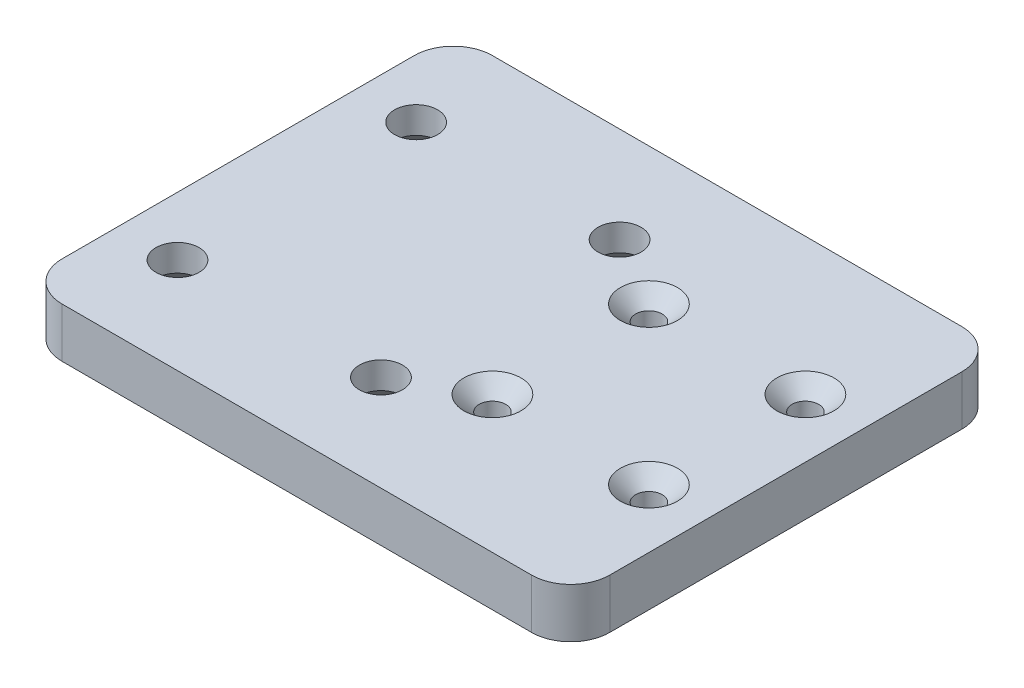
ISO-10303-21;
HEADER;
FILE_DESCRIPTION(('STEP AP214'),'2;1');
FILE_NAME('part.step','',(''),(''),'','','');
FILE_SCHEMA(('AUTOMOTIVE_DESIGN { 1 0 10303 214 1 1 1 1 }'));
ENDSEC;
DATA;
#1=APPLICATION_CONTEXT('core data for automotive mechanical design processes');
#2=APPLICATION_PROTOCOL_DEFINITION('international standard','automotive_design',2000,#1);
#3=PRODUCT_CONTEXT('',#1,'mechanical');
#4=PRODUCT('Part','Part','',(#3));
#5=PRODUCT_RELATED_PRODUCT_CATEGORY('part','',(#4));
#6=PRODUCT_DEFINITION_FORMATION('','',#4);
#7=PRODUCT_DEFINITION_CONTEXT('part definition',#1,'design');
#8=PRODUCT_DEFINITION('design','',#6,#7);
#9=PRODUCT_DEFINITION_SHAPE('','',#8);
#10=(LENGTH_UNIT() NAMED_UNIT(*) SI_UNIT(.MILLI.,.METRE.));
#11=(NAMED_UNIT(*) PLANE_ANGLE_UNIT() SI_UNIT($,.RADIAN.));
#12=(NAMED_UNIT(*) SI_UNIT($,.STERADIAN.) SOLID_ANGLE_UNIT());
#13=UNCERTAINTY_MEASURE_WITH_UNIT(LENGTH_MEASURE(1.E-05),#10,'distance_accuracy_value','');
#14=(GEOMETRIC_REPRESENTATION_CONTEXT(3) GLOBAL_UNCERTAINTY_ASSIGNED_CONTEXT((#13)) GLOBAL_UNIT_ASSIGNED_CONTEXT((#10,
#11,#12)) REPRESENTATION_CONTEXT('',''));
#15=CARTESIAN_POINT('',(0.,0.,0.));
#16=DIRECTION('',(0.,0.,1.));
#17=DIRECTION('',(1.,0.,0.));
#18=AXIS2_PLACEMENT_3D('',#15,#16,#17);
#19=CARTESIAN_POINT('',(0.,6.35,0.));
#20=DIRECTION('',(0.,-1.,0.));
#21=DIRECTION('',(0.,0.,-1.));
#22=AXIS2_PLACEMENT_3D('',#19,#20,#21);
#23=PLANE('',#22);
#24=CARTESIAN_POINT('',(-24.7884036428891,6.34999999999999,15.2500000000005));
#25=DIRECTION('',(0.,-1.,0.));
#26=DIRECTION('',(0.,0.,-1.));
#27=AXIS2_PLACEMENT_3D('',#24,#25,#26);
#28=CIRCLE('',#27,2.74999999999999);
#29=CARTESIAN_POINT('',(-24.7884036428891,6.34999999999999,12.5000000000005));
#30=VERTEX_POINT('',#29);
#31=EDGE_CURVE('E240',#30,#30,#28,.T.);
#32=ORIENTED_EDGE('',*,*,#31,.T.);
#33=EDGE_LOOP('',(#32));
#34=FACE_BOUND('',#33,.T.);
#35=CARTESIAN_POINT('',(-24.7884036428891,6.34999999999999,-15.2499999999995));
#36=DIRECTION('',(0.,-1.,0.));
#37=DIRECTION('',(0.,0.,-1.));
#38=AXIS2_PLACEMENT_3D('',#35,#36,#37);
#39=CIRCLE('',#38,2.74999999999999);
#40=CARTESIAN_POINT('',(-24.7884036428891,6.34999999999999,-17.9999999999995));
#41=VERTEX_POINT('',#40);
#42=EDGE_CURVE('E231',#41,#41,#39,.T.);
#43=ORIENTED_EDGE('',*,*,#42,.T.);
#44=EDGE_LOOP('',(#43));
#45=FACE_BOUND('',#44,.T.);
#46=CARTESIAN_POINT('',(1.21159635711091,6.34999999999999,-15.2500000000005));
#47=DIRECTION('',(0.,-1.,0.));
#48=DIRECTION('',(0.,0.,-1.));
#49=AXIS2_PLACEMENT_3D('',#46,#47,#48);
#50=CIRCLE('',#49,2.74999999999999);
#51=CARTESIAN_POINT('',(1.21159635711091,6.34999999999999,-18.0000000000005));
#52=VERTEX_POINT('',#51);
#53=EDGE_CURVE('E222',#52,#52,#50,.T.);
#54=ORIENTED_EDGE('',*,*,#53,.T.);
#55=EDGE_LOOP('',(#54));
#56=FACE_BOUND('',#55,.T.);
#57=CARTESIAN_POINT('',(1.21159635711091,6.34999999999999,15.2500000000005));
#58=DIRECTION('',(0.,-1.,0.));
#59=DIRECTION('',(0.,0.,-1.));
#60=AXIS2_PLACEMENT_3D('',#57,#58,#59);
#61=CIRCLE('',#60,2.74999999999999);
#62=CARTESIAN_POINT('',(1.21159635711091,6.34999999999999,12.5000000000005));
#63=VERTEX_POINT('',#62);
#64=EDGE_CURVE('E213',#63,#63,#61,.T.);
#65=ORIENTED_EDGE('',*,*,#64,.T.);
#66=EDGE_LOOP('',(#65));
#67=FACE_BOUND('',#66,.T.);
#68=CARTESIAN_POINT('',(30.2115963571109,6.35,10.));
#69=DIRECTION('',(0.,1.,0.));
#70=DIRECTION('',(0.,0.,1.));
#71=AXIS2_PLACEMENT_3D('',#68,#69,#70);
#72=CIRCLE('',#71,3.65);
#73=CARTESIAN_POINT('',(30.2115963571109,6.35,13.65));
#74=VERTEX_POINT('',#73);
#75=EDGE_CURVE('E210',#74,#74,#72,.T.);
#76=ORIENTED_EDGE('',*,*,#75,.F.);
#77=EDGE_LOOP('',(#76));
#78=FACE_BOUND('',#77,.T.);
#79=CARTESIAN_POINT('',(10.2115963571109,6.35,10.));
#80=DIRECTION('',(0.,1.,0.));
#81=DIRECTION('',(0.,0.,1.));
#82=AXIS2_PLACEMENT_3D('',#79,#80,#81);
#83=CIRCLE('',#82,3.65);
#84=CARTESIAN_POINT('',(10.2115963571109,6.35,13.65));
#85=VERTEX_POINT('',#84);
#86=EDGE_CURVE('E201',#85,#85,#83,.T.);
#87=ORIENTED_EDGE('',*,*,#86,.F.);
#88=EDGE_LOOP('',(#87));
#89=FACE_BOUND('',#88,.T.);
#90=CARTESIAN_POINT('',(10.2115963571109,6.35,-9.99999999999999));
#91=DIRECTION('',(0.,1.,0.));
#92=DIRECTION('',(0.,0.,1.));
#93=AXIS2_PLACEMENT_3D('',#90,#91,#92);
#94=CIRCLE('',#93,3.65);
#95=CARTESIAN_POINT('',(10.2115963571109,6.35,-6.34999999999999));
#96=VERTEX_POINT('',#95);
#97=EDGE_CURVE('E192',#96,#96,#94,.T.);
#98=ORIENTED_EDGE('',*,*,#97,.F.);
#99=EDGE_LOOP('',(#98));
#100=FACE_BOUND('',#99,.T.);
#101=DIRECTION('',(-1.,0.,0.));
#102=VECTOR('',#101,1.);
#103=CARTESIAN_POINT('',(37.7115963571109,6.35,27.5));
#104=LINE('',#103,#102);
#105=CARTESIAN_POINT('',(32.7115963571109,6.35,27.5));
#106=VERTEX_POINT('',#105);
#107=CARTESIAN_POINT('',(-27.2884036428891,6.35,27.5));
#108=VERTEX_POINT('',#107);
#109=EDGE_CURVE('E126',#106,#108,#104,.T.);
#110=ORIENTED_EDGE('',*,*,#109,.F.);
#111=CARTESIAN_POINT('',(32.7115963571109,6.35,22.5));
#112=DIRECTION('',(0.,-1.,0.));
#113=DIRECTION('',(0.,0.,-1.));
#114=AXIS2_PLACEMENT_3D('',#111,#112,#113);
#115=CIRCLE('',#114,5.);
#116=CARTESIAN_POINT('',(37.7115963571109,6.35,22.5));
#117=VERTEX_POINT('',#116);
#118=EDGE_CURVE('E150',#106,#117,#115,.F.);
#119=ORIENTED_EDGE('',*,*,#118,.T.);
#120=DIRECTION('',(0.,0.,-1.));
#121=VECTOR('',#120,1.);
#122=CARTESIAN_POINT('',(37.7115963571109,6.35,27.5));
#123=LINE('',#122,#121);
#124=CARTESIAN_POINT('',(37.7115963571109,6.35,-22.5));
#125=VERTEX_POINT('',#124);
#126=EDGE_CURVE('E119',#117,#125,#123,.T.);
#127=ORIENTED_EDGE('',*,*,#126,.T.);
#128=CARTESIAN_POINT('',(32.7115963571109,6.35,-22.5));
#129=DIRECTION('',(0.,-1.,0.));
#130=DIRECTION('',(0.,0.,-1.));
#131=AXIS2_PLACEMENT_3D('',#128,#129,#130);
#132=CIRCLE('',#131,5.);
#133=CARTESIAN_POINT('',(32.7115963571109,6.35,-27.5));
#134=VERTEX_POINT('',#133);
#135=EDGE_CURVE('E145',#125,#134,#132,.F.);
#136=ORIENTED_EDGE('',*,*,#135,.T.);
#137=DIRECTION('',(-1.,0.,0.));
#138=VECTOR('',#137,1.);
#139=CARTESIAN_POINT('',(37.7115963571109,6.35,-27.5));
#140=LINE('',#139,#138);
#141=CARTESIAN_POINT('',(-27.2884036428891,6.35,-27.5));
#142=VERTEX_POINT('',#141);
#143=EDGE_CURVE('E161',#134,#142,#140,.T.);
#144=ORIENTED_EDGE('',*,*,#143,.T.);
#145=CARTESIAN_POINT('',(-27.2884036428891,6.35,-22.5));
#146=DIRECTION('',(0.,-1.,0.));
#147=DIRECTION('',(0.,0.,-1.));
#148=AXIS2_PLACEMENT_3D('',#145,#146,#147);
#149=CIRCLE('',#148,5.);
#150=CARTESIAN_POINT('',(-32.2884036428891,6.35,-22.5));
#151=VERTEX_POINT('',#150);
#152=EDGE_CURVE('E48',#142,#151,#149,.F.);
#153=ORIENTED_EDGE('',*,*,#152,.T.);
#154=DIRECTION('',(0.,0.,-1.));
#155=VECTOR('',#154,1.);
#156=CARTESIAN_POINT('',(-32.2884036428891,6.35,27.5));
#157=LINE('',#156,#155);
#158=CARTESIAN_POINT('',(-32.2884036428891,6.35,22.5));
#159=VERTEX_POINT('',#158);
#160=EDGE_CURVE('E130',#159,#151,#157,.T.);
#161=ORIENTED_EDGE('',*,*,#160,.F.);
#162=CARTESIAN_POINT('',(-27.2884036428891,6.35,22.5));
#163=DIRECTION('',(0.,-1.,0.));
#164=DIRECTION('',(0.,0.,-1.));
#165=AXIS2_PLACEMENT_3D('',#162,#163,#164);
#166=CIRCLE('',#165,5.);
#167=EDGE_CURVE('E148',#159,#108,#166,.F.);
#168=ORIENTED_EDGE('',*,*,#167,.T.);
#169=EDGE_LOOP('',(#110,#119,#127,#136,#144,#153,#161,#168));
#170=FACE_BOUND('',#169,.T.);
#171=CARTESIAN_POINT('',(30.2115963571109,6.35,-10.));
#172=DIRECTION('',(0.,1.,0.));
#173=DIRECTION('',(0.,0.,1.));
#174=AXIS2_PLACEMENT_3D('',#171,#172,#173);
#175=CIRCLE('',#174,3.65);
#176=CARTESIAN_POINT('',(30.2115963571109,6.35,-6.35));
#177=VERTEX_POINT('',#176);
#178=EDGE_CURVE('E181',#177,#177,#175,.T.);
#179=ORIENTED_EDGE('',*,*,#178,.F.);
#180=EDGE_LOOP('',(#179));
#181=FACE_BOUND('',#180,.T.);
#182=ADVANCED_FACE('F33',(#34,#45,#56,#67,#78,#89,#100,#170,#181),#23,.F.);
#183=CARTESIAN_POINT('',(0.,0.,0.));
#184=DIRECTION('',(0.,-1.,0.));
#185=DIRECTION('',(0.,0.,-1.));
#186=AXIS2_PLACEMENT_3D('',#183,#184,#185);
#187=PLANE('',#186);
#188=CARTESIAN_POINT('',(-24.7884036428891,0.,15.2500000000005));
#189=DIRECTION('',(0.,-1.,0.));
#190=DIRECTION('',(0.,0.,-1.));
#191=AXIS2_PLACEMENT_3D('',#188,#189,#190);
#192=CIRCLE('',#191,5.7);
#193=CARTESIAN_POINT('',(-24.7884036428891,0.,9.55000000000047));
#194=VERTEX_POINT('',#193);
#195=EDGE_CURVE('E246',#194,#194,#192,.T.);
#196=ORIENTED_EDGE('',*,*,#195,.F.);
#197=EDGE_LOOP('',(#196));
#198=FACE_BOUND('',#197,.T.);
#199=CARTESIAN_POINT('',(-24.7884036428891,0.,-15.2499999999995));
#200=DIRECTION('',(0.,-1.,0.));
#201=DIRECTION('',(0.,0.,-1.));
#202=AXIS2_PLACEMENT_3D('',#199,#200,#201);
#203=CIRCLE('',#202,5.7);
#204=CARTESIAN_POINT('',(-24.7884036428891,0.,-20.9499999999995));
#205=VERTEX_POINT('',#204);
#206=EDGE_CURVE('E237',#205,#205,#203,.T.);
#207=ORIENTED_EDGE('',*,*,#206,.F.);
#208=EDGE_LOOP('',(#207));
#209=FACE_BOUND('',#208,.T.);
#210=CARTESIAN_POINT('',(1.21159635711091,0.,-15.2500000000005));
#211=DIRECTION('',(0.,-1.,0.));
#212=DIRECTION('',(0.,0.,-1.));
#213=AXIS2_PLACEMENT_3D('',#210,#211,#212);
#214=CIRCLE('',#213,5.7);
#215=CARTESIAN_POINT('',(1.21159635711091,0.,-20.9500000000005));
#216=VERTEX_POINT('',#215);
#217=EDGE_CURVE('E228',#216,#216,#214,.T.);
#218=ORIENTED_EDGE('',*,*,#217,.F.);
#219=EDGE_LOOP('',(#218));
#220=FACE_BOUND('',#219,.T.);
#221=CARTESIAN_POINT('',(1.21159635711091,0.,15.2500000000005));
#222=DIRECTION('',(0.,-1.,0.));
#223=DIRECTION('',(0.,0.,-1.));
#224=AXIS2_PLACEMENT_3D('',#221,#222,#223);
#225=CIRCLE('',#224,5.7);
#226=CARTESIAN_POINT('',(1.21159635711091,0.,9.55000000000047));
#227=VERTEX_POINT('',#226);
#228=EDGE_CURVE('E219',#227,#227,#225,.T.);
#229=ORIENTED_EDGE('',*,*,#228,.F.);
#230=EDGE_LOOP('',(#229));
#231=FACE_BOUND('',#230,.T.);
#232=CARTESIAN_POINT('',(30.2115963571109,0.,10.));
#233=DIRECTION('',(0.,1.,0.));
#234=DIRECTION('',(0.,0.,1.));
#235=AXIS2_PLACEMENT_3D('',#232,#233,#234);
#236=CIRCLE('',#235,1.7);
#237=CARTESIAN_POINT('',(30.2115963571109,0.,11.7));
#238=VERTEX_POINT('',#237);
#239=EDGE_CURVE('E204',#238,#238,#236,.T.);
#240=ORIENTED_EDGE('',*,*,#239,.T.);
#241=EDGE_LOOP('',(#240));
#242=FACE_BOUND('',#241,.T.);
#243=CARTESIAN_POINT('',(10.2115963571109,0.,10.));
#244=DIRECTION('',(0.,1.,0.));
#245=DIRECTION('',(0.,0.,1.));
#246=AXIS2_PLACEMENT_3D('',#243,#244,#245);
#247=CIRCLE('',#246,1.7);
#248=CARTESIAN_POINT('',(10.2115963571109,0.,11.7));
#249=VERTEX_POINT('',#248);
#250=EDGE_CURVE('E195',#249,#249,#247,.T.);
#251=ORIENTED_EDGE('',*,*,#250,.T.);
#252=EDGE_LOOP('',(#251));
#253=FACE_BOUND('',#252,.T.);
#254=CARTESIAN_POINT('',(10.2115963571109,0.,-9.99999999999999));
#255=DIRECTION('',(0.,1.,0.));
#256=DIRECTION('',(0.,0.,1.));
#257=AXIS2_PLACEMENT_3D('',#254,#255,#256);
#258=CIRCLE('',#257,1.7);
#259=CARTESIAN_POINT('',(10.2115963571109,0.,-8.3));
#260=VERTEX_POINT('',#259);
#261=EDGE_CURVE('E186',#260,#260,#258,.T.);
#262=ORIENTED_EDGE('',*,*,#261,.T.);
#263=EDGE_LOOP('',(#262));
#264=FACE_BOUND('',#263,.T.);
#265=DIRECTION('',(0.,0.,-1.));
#266=VECTOR('',#265,1.);
#267=CARTESIAN_POINT('',(37.7115963571109,0.,27.5));
#268=LINE('',#267,#266);
#269=CARTESIAN_POINT('',(37.7115963571109,0.,22.5));
#270=VERTEX_POINT('',#269);
#271=CARTESIAN_POINT('',(37.7115963571109,0.,-22.5));
#272=VERTEX_POINT('',#271);
#273=EDGE_CURVE('E116',#270,#272,#268,.T.);
#274=ORIENTED_EDGE('',*,*,#273,.F.);
#275=CARTESIAN_POINT('',(32.7115963571109,0.,22.5));
#276=DIRECTION('',(0.,-1.,0.));
#277=DIRECTION('',(0.,0.,-1.));
#278=AXIS2_PLACEMENT_3D('',#275,#276,#277);
#279=CIRCLE('',#278,5.);
#280=CARTESIAN_POINT('',(32.7115963571109,0.,27.5));
#281=VERTEX_POINT('',#280);
#282=EDGE_CURVE('E99',#270,#281,#279,.T.);
#283=ORIENTED_EDGE('',*,*,#282,.T.);
#284=DIRECTION('',(-1.,0.,0.));
#285=VECTOR('',#284,1.);
#286=CARTESIAN_POINT('',(37.7115963571109,0.,27.5));
#287=LINE('',#286,#285);
#288=CARTESIAN_POINT('',(-27.2884036428891,0.,27.5));
#289=VERTEX_POINT('',#288);
#290=EDGE_CURVE('E175',#281,#289,#287,.T.);
#291=ORIENTED_EDGE('',*,*,#290,.T.);
#292=CARTESIAN_POINT('',(-27.2884036428891,0.,22.5));
#293=DIRECTION('',(0.,-1.,0.));
#294=DIRECTION('',(0.,0.,-1.));
#295=AXIS2_PLACEMENT_3D('',#292,#293,#294);
#296=CIRCLE('',#295,5.);
#297=CARTESIAN_POINT('',(-32.2884036428891,0.,22.5));
#298=VERTEX_POINT('',#297);
#299=EDGE_CURVE('E110',#289,#298,#296,.T.);
#300=ORIENTED_EDGE('',*,*,#299,.T.);
#301=DIRECTION('',(0.,0.,-1.));
#302=VECTOR('',#301,1.);
#303=CARTESIAN_POINT('',(-32.2884036428891,0.,27.5));
#304=LINE('',#303,#302);
#305=CARTESIAN_POINT('',(-32.2884036428891,0.,-22.5));
#306=VERTEX_POINT('',#305);
#307=EDGE_CURVE('E133',#298,#306,#304,.T.);
#308=ORIENTED_EDGE('',*,*,#307,.T.);
#309=CARTESIAN_POINT('',(-27.2884036428891,0.,-22.5));
#310=DIRECTION('',(0.,-1.,0.));
#311=DIRECTION('',(0.,0.,-1.));
#312=AXIS2_PLACEMENT_3D('',#309,#310,#311);
#313=CIRCLE('',#312,5.);
#314=CARTESIAN_POINT('',(-27.2884036428891,0.,-27.5));
#315=VERTEX_POINT('',#314);
#316=EDGE_CURVE('E139',#306,#315,#313,.T.);
#317=ORIENTED_EDGE('',*,*,#316,.T.);
#318=DIRECTION('',(-1.,0.,0.));
#319=VECTOR('',#318,1.);
#320=CARTESIAN_POINT('',(37.7115963571109,0.,-27.5));
#321=LINE('',#320,#319);
#322=CARTESIAN_POINT('',(32.7115963571109,0.,-27.5));
#323=VERTEX_POINT('',#322);
#324=EDGE_CURVE('E127',#323,#315,#321,.T.);
#325=ORIENTED_EDGE('',*,*,#324,.F.);
#326=CARTESIAN_POINT('',(32.7115963571109,0.,-22.5));
#327=DIRECTION('',(0.,-1.,0.));
#328=DIRECTION('',(0.,0.,-1.));
#329=AXIS2_PLACEMENT_3D('',#326,#327,#328);
#330=CIRCLE('',#329,5.);
#331=EDGE_CURVE('E120',#323,#272,#330,.T.);
#332=ORIENTED_EDGE('',*,*,#331,.T.);
#333=EDGE_LOOP('',(#274,#283,#291,#300,#308,#317,#325,#332));
#334=FACE_BOUND('',#333,.T.);
#335=CARTESIAN_POINT('',(30.2115963571109,0.,-10.));
#336=DIRECTION('',(0.,1.,0.));
#337=DIRECTION('',(0.,0.,1.));
#338=AXIS2_PLACEMENT_3D('',#335,#336,#337);
#339=CIRCLE('',#338,1.7);
#340=CARTESIAN_POINT('',(30.2115963571109,0.,-8.3));
#341=VERTEX_POINT('',#340);
#342=EDGE_CURVE('E176',#341,#341,#339,.T.);
#343=ORIENTED_EDGE('',*,*,#342,.T.);
#344=EDGE_LOOP('',(#343));
#345=FACE_BOUND('',#344,.T.);
#346=ADVANCED_FACE('F123',(#198,#209,#220,#231,#242,#253,#264,#334,#345),#187,.T.);
#347=CARTESIAN_POINT('',(37.7115963571109,6.35,27.5));
#348=DIRECTION('',(0.,0.,1.));
#349=DIRECTION('',(1.,0.,0.));
#350=AXIS2_PLACEMENT_3D('',#347,#348,#349);
#351=PLANE('',#350);
#352=ORIENTED_EDGE('',*,*,#290,.F.);
#353=DIRECTION('',(0.,-1.,0.));
#354=VECTOR('',#353,1.);
#355=CARTESIAN_POINT('',(32.7115963571109,6.35,27.5));
#356=LINE('',#355,#354);
#357=EDGE_CURVE('E104',#281,#106,#356,.F.);
#358=ORIENTED_EDGE('',*,*,#357,.T.);
#359=ORIENTED_EDGE('',*,*,#109,.T.);
#360=DIRECTION('',(0.,-1.,0.));
#361=VECTOR('',#360,1.);
#362=CARTESIAN_POINT('',(-27.2884036428891,6.35,27.5));
#363=LINE('',#362,#361);
#364=EDGE_CURVE('E109',#108,#289,#363,.T.);
#365=ORIENTED_EDGE('',*,*,#364,.T.);
#366=EDGE_LOOP('',(#352,#358,#359,#365));
#367=FACE_BOUND('',#366,.T.);
#368=ADVANCED_FACE('F254',(#367),#351,.T.);
#369=CARTESIAN_POINT('',(37.7115963571109,6.35,27.5));
#370=DIRECTION('',(-1.,0.,0.));
#371=DIRECTION('',(0.,0.,1.));
#372=AXIS2_PLACEMENT_3D('',#369,#370,#371);
#373=PLANE('',#372);
#374=ORIENTED_EDGE('',*,*,#126,.F.);
#375=DIRECTION('',(0.,-1.,0.));
#376=VECTOR('',#375,1.);
#377=CARTESIAN_POINT('',(37.7115963571109,0.,22.5));
#378=LINE('',#377,#376);
#379=EDGE_CURVE('E103',#117,#270,#378,.T.);
#380=ORIENTED_EDGE('',*,*,#379,.T.);
#381=ORIENTED_EDGE('',*,*,#273,.T.);
#382=DIRECTION('',(0.,-1.,0.));
#383=VECTOR('',#382,1.);
#384=CARTESIAN_POINT('',(37.7115963571109,6.35,-22.5));
#385=LINE('',#384,#383);
#386=EDGE_CURVE('E121',#272,#125,#385,.F.);
#387=ORIENTED_EDGE('',*,*,#386,.T.);
#388=EDGE_LOOP('',(#374,#380,#381,#387));
#389=FACE_BOUND('',#388,.T.);
#390=ADVANCED_FACE('F115',(#389),#373,.F.);
#391=CARTESIAN_POINT('',(37.7115963571109,6.35,-27.5));
#392=DIRECTION('',(0.,0.,1.));
#393=DIRECTION('',(1.,0.,0.));
#394=AXIS2_PLACEMENT_3D('',#391,#392,#393);
#395=PLANE('',#394);
#396=ORIENTED_EDGE('',*,*,#324,.T.);
#397=DIRECTION('',(0.,-1.,0.));
#398=VECTOR('',#397,1.);
#399=CARTESIAN_POINT('',(-27.2884036428891,6.35,-27.5));
#400=LINE('',#399,#398);
#401=EDGE_CURVE('E11',#315,#142,#400,.F.);
#402=ORIENTED_EDGE('',*,*,#401,.T.);
#403=ORIENTED_EDGE('',*,*,#143,.F.);
#404=DIRECTION('',(0.,-1.,0.));
#405=VECTOR('',#404,1.);
#406=CARTESIAN_POINT('',(32.7115963571109,6.35,-27.5));
#407=LINE('',#406,#405);
#408=EDGE_CURVE('E41',#134,#323,#407,.T.);
#409=ORIENTED_EDGE('',*,*,#408,.T.);
#410=EDGE_LOOP('',(#396,#402,#403,#409));
#411=FACE_BOUND('',#410,.T.);
#412=ADVANCED_FACE('F159',(#411),#395,.F.);
#413=CARTESIAN_POINT('',(-32.2884036428891,6.35,27.5));
#414=DIRECTION('',(-1.,0.,0.));
#415=DIRECTION('',(0.,0.,1.));
#416=AXIS2_PLACEMENT_3D('',#413,#414,#415);
#417=PLANE('',#416);
#418=ORIENTED_EDGE('',*,*,#307,.F.);
#419=DIRECTION('',(0.,-1.,0.));
#420=VECTOR('',#419,1.);
#421=CARTESIAN_POINT('',(-32.2884036428891,6.35,22.5));
#422=LINE('',#421,#420);
#423=EDGE_CURVE('E55',#298,#159,#422,.F.);
#424=ORIENTED_EDGE('',*,*,#423,.T.);
#425=ORIENTED_EDGE('',*,*,#160,.T.);
#426=DIRECTION('',(0.,-1.,0.));
#427=VECTOR('',#426,1.);
#428=CARTESIAN_POINT('',(-32.2884036428891,0.,-22.5));
#429=LINE('',#428,#427);
#430=EDGE_CURVE('E152',#151,#306,#429,.T.);
#431=ORIENTED_EDGE('',*,*,#430,.T.);
#432=EDGE_LOOP('',(#418,#424,#425,#431));
#433=FACE_BOUND('',#432,.T.);
#434=ADVANCED_FACE('F168',(#433),#417,.T.);
#435=CARTESIAN_POINT('',(30.2115963571109,6.35,-10.));
#436=DIRECTION('',(0.,1.,0.));
#437=DIRECTION('',(0.,0.,1.));
#438=AXIS2_PLACEMENT_3D('',#435,#436,#437);
#439=CYLINDRICAL_SURFACE('',#438,1.7);
#440=ORIENTED_EDGE('',*,*,#342,.F.);
#441=EDGE_LOOP('',(#440));
#442=FACE_BOUND('',#441,.T.);
#443=CARTESIAN_POINT('',(30.2115963571109,4.4,-10.));
#444=DIRECTION('',(0.,1.,0.));
#445=DIRECTION('',(0.,0.,1.));
#446=AXIS2_PLACEMENT_3D('',#443,#444,#445);
#447=CIRCLE('',#446,1.7);
#448=CARTESIAN_POINT('',(30.2115963571109,4.4,-8.3));
#449=VERTEX_POINT('',#448);
#450=EDGE_CURVE('E178',#449,#449,#447,.T.);
#451=ORIENTED_EDGE('',*,*,#450,.T.);
#452=EDGE_LOOP('',(#451));
#453=FACE_BOUND('',#452,.T.);
#454=ADVANCED_FACE('F290',(#442,#453),#439,.F.);
#455=CARTESIAN_POINT('',(30.2115963571109,6.35,-10.));
#456=DIRECTION('',(0.,1.,0.));
#457=DIRECTION('',(0.,0.,1.));
#458=AXIS2_PLACEMENT_3D('',#455,#456,#457);
#459=CONICAL_SURFACE('',#458,3.65,0.785398163397449);
#460=ORIENTED_EDGE('',*,*,#450,.F.);
#461=EDGE_LOOP('',(#460));
#462=FACE_BOUND('',#461,.T.);
#463=ORIENTED_EDGE('',*,*,#178,.T.);
#464=EDGE_LOOP('',(#463));
#465=FACE_BOUND('',#464,.T.);
#466=ADVANCED_FACE('F272',(#462,#465),#459,.F.);
#467=CARTESIAN_POINT('',(10.2115963571109,6.35,-9.99999999999999));
#468=DIRECTION('',(0.,1.,0.));
#469=DIRECTION('',(0.,0.,1.));
#470=AXIS2_PLACEMENT_3D('',#467,#468,#469);
#471=CYLINDRICAL_SURFACE('',#470,1.7);
#472=ORIENTED_EDGE('',*,*,#261,.F.);
#473=EDGE_LOOP('',(#472));
#474=FACE_BOUND('',#473,.T.);
#475=CARTESIAN_POINT('',(10.2115963571109,4.4,-9.99999999999999));
#476=DIRECTION('',(0.,1.,0.));
#477=DIRECTION('',(0.,0.,1.));
#478=AXIS2_PLACEMENT_3D('',#475,#476,#477);
#479=CIRCLE('',#478,1.7);
#480=CARTESIAN_POINT('',(10.2115963571109,4.4,-8.3));
#481=VERTEX_POINT('',#480);
#482=EDGE_CURVE('E189',#481,#481,#479,.T.);
#483=ORIENTED_EDGE('',*,*,#482,.T.);
#484=EDGE_LOOP('',(#483));
#485=FACE_BOUND('',#484,.T.);
#486=ADVANCED_FACE('F268',(#474,#485),#471,.F.);
#487=CARTESIAN_POINT('',(10.2115963571109,6.35,-9.99999999999999));
#488=DIRECTION('',(0.,1.,0.));
#489=DIRECTION('',(0.,0.,1.));
#490=AXIS2_PLACEMENT_3D('',#487,#488,#489);
#491=CONICAL_SURFACE('',#490,3.65,0.785398163397449);
#492=ORIENTED_EDGE('',*,*,#482,.F.);
#493=EDGE_LOOP('',(#492));
#494=FACE_BOUND('',#493,.T.);
#495=ORIENTED_EDGE('',*,*,#97,.T.);
#496=EDGE_LOOP('',(#495));
#497=FACE_BOUND('',#496,.T.);
#498=ADVANCED_FACE('F271',(#494,#497),#491,.F.);
#499=CARTESIAN_POINT('',(10.2115963571109,6.35,10.));
#500=DIRECTION('',(0.,1.,0.));
#501=DIRECTION('',(0.,0.,1.));
#502=AXIS2_PLACEMENT_3D('',#499,#500,#501);
#503=CYLINDRICAL_SURFACE('',#502,1.7);
#504=ORIENTED_EDGE('',*,*,#250,.F.);
#505=EDGE_LOOP('',(#504));
#506=FACE_BOUND('',#505,.T.);
#507=CARTESIAN_POINT('',(10.2115963571109,4.4,10.));
#508=DIRECTION('',(0.,1.,0.));
#509=DIRECTION('',(0.,0.,1.));
#510=AXIS2_PLACEMENT_3D('',#507,#508,#509);
#511=CIRCLE('',#510,1.7);
#512=CARTESIAN_POINT('',(10.2115963571109,4.4,11.7));
#513=VERTEX_POINT('',#512);
#514=EDGE_CURVE('E198',#513,#513,#511,.T.);
#515=ORIENTED_EDGE('',*,*,#514,.T.);
#516=EDGE_LOOP('',(#515));
#517=FACE_BOUND('',#516,.T.);
#518=ADVANCED_FACE('F278',(#506,#517),#503,.F.);
#519=CARTESIAN_POINT('',(10.2115963571109,6.35,10.));
#520=DIRECTION('',(0.,1.,0.));
#521=DIRECTION('',(0.,0.,1.));
#522=AXIS2_PLACEMENT_3D('',#519,#520,#521);
#523=CONICAL_SURFACE('',#522,3.65,0.785398163397449);
#524=ORIENTED_EDGE('',*,*,#514,.F.);
#525=EDGE_LOOP('',(#524));
#526=FACE_BOUND('',#525,.T.);
#527=ORIENTED_EDGE('',*,*,#86,.T.);
#528=EDGE_LOOP('',(#527));
#529=FACE_BOUND('',#528,.T.);
#530=ADVANCED_FACE('F342',(#526,#529),#523,.F.);
#531=CARTESIAN_POINT('',(30.2115963571109,6.35,10.));
#532=DIRECTION('',(0.,1.,0.));
#533=DIRECTION('',(0.,0.,1.));
#534=AXIS2_PLACEMENT_3D('',#531,#532,#533);
#535=CYLINDRICAL_SURFACE('',#534,1.7);
#536=ORIENTED_EDGE('',*,*,#239,.F.);
#537=EDGE_LOOP('',(#536));
#538=FACE_BOUND('',#537,.T.);
#539=CARTESIAN_POINT('',(30.2115963571109,4.4,10.));
#540=DIRECTION('',(0.,1.,0.));
#541=DIRECTION('',(0.,0.,1.));
#542=AXIS2_PLACEMENT_3D('',#539,#540,#541);
#543=CIRCLE('',#542,1.7);
#544=CARTESIAN_POINT('',(30.2115963571109,4.4,11.7));
#545=VERTEX_POINT('',#544);
#546=EDGE_CURVE('E207',#545,#545,#543,.T.);
#547=ORIENTED_EDGE('',*,*,#546,.T.);
#548=EDGE_LOOP('',(#547));
#549=FACE_BOUND('',#548,.T.);
#550=ADVANCED_FACE('F338',(#538,#549),#535,.F.);
#551=CARTESIAN_POINT('',(30.2115963571109,6.35,10.));
#552=DIRECTION('',(0.,1.,0.));
#553=DIRECTION('',(0.,0.,1.));
#554=AXIS2_PLACEMENT_3D('',#551,#552,#553);
#555=CONICAL_SURFACE('',#554,3.65,0.785398163397449);
#556=ORIENTED_EDGE('',*,*,#546,.F.);
#557=EDGE_LOOP('',(#556));
#558=FACE_BOUND('',#557,.T.);
#559=ORIENTED_EDGE('',*,*,#75,.T.);
#560=EDGE_LOOP('',(#559));
#561=FACE_BOUND('',#560,.T.);
#562=ADVANCED_FACE('F312',(#558,#561),#555,.F.);
#563=CARTESIAN_POINT('',(32.7115963571109,6.35,22.5));
#564=DIRECTION('',(0.,1.,0.));
#565=DIRECTION('',(0.,0.,1.));
#566=AXIS2_PLACEMENT_3D('',#563,#564,#565);
#567=CYLINDRICAL_SURFACE('',#566,5.);
#568=ORIENTED_EDGE('',*,*,#118,.F.);
#569=ORIENTED_EDGE('',*,*,#357,.F.);
#570=ORIENTED_EDGE('',*,*,#282,.F.);
#571=ORIENTED_EDGE('',*,*,#379,.F.);
#572=EDGE_LOOP('',(#568,#569,#570,#571));
#573=FACE_BOUND('',#572,.T.);
#574=ADVANCED_FACE('F102',(#573),#567,.T.);
#575=CARTESIAN_POINT('',(-27.2884036428891,6.35,22.5));
#576=DIRECTION('',(0.,-1.,0.));
#577=DIRECTION('',(0.,0.,-1.));
#578=AXIS2_PLACEMENT_3D('',#575,#576,#577);
#579=CYLINDRICAL_SURFACE('',#578,5.);
#580=ORIENTED_EDGE('',*,*,#167,.F.);
#581=ORIENTED_EDGE('',*,*,#423,.F.);
#582=ORIENTED_EDGE('',*,*,#299,.F.);
#583=ORIENTED_EDGE('',*,*,#364,.F.);
#584=EDGE_LOOP('',(#580,#581,#582,#583));
#585=FACE_BOUND('',#584,.T.);
#586=ADVANCED_FACE('F311',(#585),#579,.T.);
#587=CARTESIAN_POINT('',(-27.2884036428891,6.35,-22.5));
#588=DIRECTION('',(0.,1.,0.));
#589=DIRECTION('',(0.,0.,1.));
#590=AXIS2_PLACEMENT_3D('',#587,#588,#589);
#591=CYLINDRICAL_SURFACE('',#590,5.);
#592=ORIENTED_EDGE('',*,*,#152,.F.);
#593=ORIENTED_EDGE('',*,*,#401,.F.);
#594=ORIENTED_EDGE('',*,*,#316,.F.);
#595=ORIENTED_EDGE('',*,*,#430,.F.);
#596=EDGE_LOOP('',(#592,#593,#594,#595));
#597=FACE_BOUND('',#596,.T.);
#598=ADVANCED_FACE('F167',(#597),#591,.T.);
#599=CARTESIAN_POINT('',(32.7115963571109,6.35,-22.5));
#600=DIRECTION('',(0.,-1.,0.));
#601=DIRECTION('',(0.,0.,-1.));
#602=AXIS2_PLACEMENT_3D('',#599,#600,#601);
#603=CYLINDRICAL_SURFACE('',#602,5.);
#604=ORIENTED_EDGE('',*,*,#135,.F.);
#605=ORIENTED_EDGE('',*,*,#386,.F.);
#606=ORIENTED_EDGE('',*,*,#331,.F.);
#607=ORIENTED_EDGE('',*,*,#408,.F.);
#608=EDGE_LOOP('',(#604,#605,#606,#607));
#609=FACE_BOUND('',#608,.T.);
#610=ADVANCED_FACE('F35',(#609),#603,.T.);
#611=CARTESIAN_POINT('',(1.21159635711091,0.,15.2500000000005));
#612=DIRECTION('',(0.,-1.,0.));
#613=DIRECTION('',(0.,0.,-1.));
#614=AXIS2_PLACEMENT_3D('',#611,#612,#613);
#615=CYLINDRICAL_SURFACE('',#614,2.74999999999999);
#616=ORIENTED_EDGE('',*,*,#64,.F.);
#617=EDGE_LOOP('',(#616));
#618=FACE_BOUND('',#617,.T.);
#619=CARTESIAN_POINT('',(1.21159635711091,2.94999999999999,15.2500000000005));
#620=DIRECTION('',(0.,-1.,0.));
#621=DIRECTION('',(0.,0.,-1.));
#622=AXIS2_PLACEMENT_3D('',#619,#620,#621);
#623=CIRCLE('',#622,2.74999999999999);
#624=CARTESIAN_POINT('',(1.21159635711091,2.94999999999999,12.5000000000005));
#625=VERTEX_POINT('',#624);
#626=EDGE_CURVE('E216',#625,#625,#623,.T.);
#627=ORIENTED_EDGE('',*,*,#626,.T.);
#628=EDGE_LOOP('',(#627));
#629=FACE_BOUND('',#628,.T.);
#630=ADVANCED_FACE('F319',(#618,#629),#615,.F.);
#631=CARTESIAN_POINT('',(1.21159635711091,0.,15.2500000000005));
#632=DIRECTION('',(0.,-1.,0.));
#633=DIRECTION('',(0.,0.,-1.));
#634=AXIS2_PLACEMENT_3D('',#631,#632,#633);
#635=CONICAL_SURFACE('',#634,5.7,0.785398163397451);
#636=ORIENTED_EDGE('',*,*,#626,.F.);
#637=EDGE_LOOP('',(#636));
#638=FACE_BOUND('',#637,.T.);
#639=ORIENTED_EDGE('',*,*,#228,.T.);
#640=EDGE_LOOP('',(#639));
#641=FACE_BOUND('',#640,.T.);
#642=ADVANCED_FACE('F323',(#638,#641),#635,.F.);
#643=CARTESIAN_POINT('',(1.21159635711091,0.,-15.2500000000005));
#644=DIRECTION('',(0.,-1.,0.));
#645=DIRECTION('',(0.,0.,-1.));
#646=AXIS2_PLACEMENT_3D('',#643,#644,#645);
#647=CYLINDRICAL_SURFACE('',#646,2.74999999999999);
#648=ORIENTED_EDGE('',*,*,#53,.F.);
#649=EDGE_LOOP('',(#648));
#650=FACE_BOUND('',#649,.T.);
#651=CARTESIAN_POINT('',(1.21159635711091,2.94999999999999,-15.2500000000005));
#652=DIRECTION('',(0.,-1.,0.));
#653=DIRECTION('',(0.,0.,-1.));
#654=AXIS2_PLACEMENT_3D('',#651,#652,#653);
#655=CIRCLE('',#654,2.74999999999999);
#656=CARTESIAN_POINT('',(1.21159635711091,2.94999999999999,-18.0000000000005));
#657=VERTEX_POINT('',#656);
#658=EDGE_CURVE('E225',#657,#657,#655,.T.);
#659=ORIENTED_EDGE('',*,*,#658,.T.);
#660=EDGE_LOOP('',(#659));
#661=FACE_BOUND('',#660,.T.);
#662=ADVANCED_FACE('F329',(#650,#661),#647,.F.);
#663=CARTESIAN_POINT('',(1.21159635711091,0.,-15.2500000000005));
#664=DIRECTION('',(0.,-1.,0.));
#665=DIRECTION('',(0.,0.,-1.));
#666=AXIS2_PLACEMENT_3D('',#663,#664,#665);
#667=CONICAL_SURFACE('',#666,5.7,0.785398163397451);
#668=ORIENTED_EDGE('',*,*,#658,.F.);
#669=EDGE_LOOP('',(#668));
#670=FACE_BOUND('',#669,.T.);
#671=ORIENTED_EDGE('',*,*,#217,.T.);
#672=EDGE_LOOP('',(#671));
#673=FACE_BOUND('',#672,.T.);
#674=ADVANCED_FACE('F421',(#670,#673),#667,.F.);
#675=CARTESIAN_POINT('',(-24.7884036428891,0.,-15.2499999999995));
#676=DIRECTION('',(0.,-1.,0.));
#677=DIRECTION('',(0.,0.,-1.));
#678=AXIS2_PLACEMENT_3D('',#675,#676,#677);
#679=CYLINDRICAL_SURFACE('',#678,2.74999999999999);
#680=ORIENTED_EDGE('',*,*,#42,.F.);
#681=EDGE_LOOP('',(#680));
#682=FACE_BOUND('',#681,.T.);
#683=CARTESIAN_POINT('',(-24.7884036428891,2.94999999999999,-15.2499999999995));
#684=DIRECTION('',(0.,-1.,0.));
#685=DIRECTION('',(0.,0.,-1.));
#686=AXIS2_PLACEMENT_3D('',#683,#684,#685);
#687=CIRCLE('',#686,2.74999999999999);
#688=CARTESIAN_POINT('',(-24.7884036428891,2.94999999999999,-17.9999999999995));
#689=VERTEX_POINT('',#688);
#690=EDGE_CURVE('E234',#689,#689,#687,.T.);
#691=ORIENTED_EDGE('',*,*,#690,.T.);
#692=EDGE_LOOP('',(#691));
#693=FACE_BOUND('',#692,.T.);
#694=ADVANCED_FACE('F430',(#682,#693),#679,.F.);
#695=CARTESIAN_POINT('',(-24.7884036428891,0.,-15.2499999999995));
#696=DIRECTION('',(0.,-1.,0.));
#697=DIRECTION('',(0.,0.,-1.));
#698=AXIS2_PLACEMENT_3D('',#695,#696,#697);
#699=CONICAL_SURFACE('',#698,5.7,0.785398163397451);
#700=ORIENTED_EDGE('',*,*,#690,.F.);
#701=EDGE_LOOP('',(#700));
#702=FACE_BOUND('',#701,.T.);
#703=ORIENTED_EDGE('',*,*,#206,.T.);
#704=EDGE_LOOP('',(#703));
#705=FACE_BOUND('',#704,.T.);
#706=ADVANCED_FACE('F440',(#702,#705),#699,.F.);
#707=CARTESIAN_POINT('',(-24.7884036428891,0.,15.2500000000005));
#708=DIRECTION('',(0.,-1.,0.));
#709=DIRECTION('',(0.,0.,-1.));
#710=AXIS2_PLACEMENT_3D('',#707,#708,#709);
#711=CYLINDRICAL_SURFACE('',#710,2.74999999999999);
#712=ORIENTED_EDGE('',*,*,#31,.F.);
#713=EDGE_LOOP('',(#712));
#714=FACE_BOUND('',#713,.T.);
#715=CARTESIAN_POINT('',(-24.7884036428891,2.94999999999999,15.2500000000005));
#716=DIRECTION('',(0.,-1.,0.));
#717=DIRECTION('',(0.,0.,-1.));
#718=AXIS2_PLACEMENT_3D('',#715,#716,#717);
#719=CIRCLE('',#718,2.74999999999999);
#720=CARTESIAN_POINT('',(-24.7884036428891,2.94999999999999,12.5000000000005));
#721=VERTEX_POINT('',#720);
#722=EDGE_CURVE('E243',#721,#721,#719,.T.);
#723=ORIENTED_EDGE('',*,*,#722,.T.);
#724=EDGE_LOOP('',(#723));
#725=FACE_BOUND('',#724,.T.);
#726=ADVANCED_FACE('F450',(#714,#725),#711,.F.);
#727=CARTESIAN_POINT('',(-24.7884036428891,0.,15.2500000000005));
#728=DIRECTION('',(0.,-1.,0.));
#729=DIRECTION('',(0.,0.,-1.));
#730=AXIS2_PLACEMENT_3D('',#727,#728,#729);
#731=CONICAL_SURFACE('',#730,5.7,0.785398163397451);
#732=ORIENTED_EDGE('',*,*,#722,.F.);
#733=EDGE_LOOP('',(#732));
#734=FACE_BOUND('',#733,.T.);
#735=ORIENTED_EDGE('',*,*,#195,.T.);
#736=EDGE_LOOP('',(#735));
#737=FACE_BOUND('',#736,.T.);
#738=ADVANCED_FACE('F250',(#734,#737),#731,.F.);
#739=CLOSED_SHELL('',(#182,#346,#368,#390,#412,#434,#454,#466,#486,#498,#518,#530,#550,#562,
#574,#586,#598,#610,#630,#642,#662,#674,#694,#706,#726,#738));
#740=MANIFOLD_SOLID_BREP('B2',#739);
#741=ADVANCED_BREP_SHAPE_REPRESENTATION('',(#18,#740),#14);
#742=SHAPE_DEFINITION_REPRESENTATION(#9,#741);
ENDSEC;
END-ISO-10303-21;
